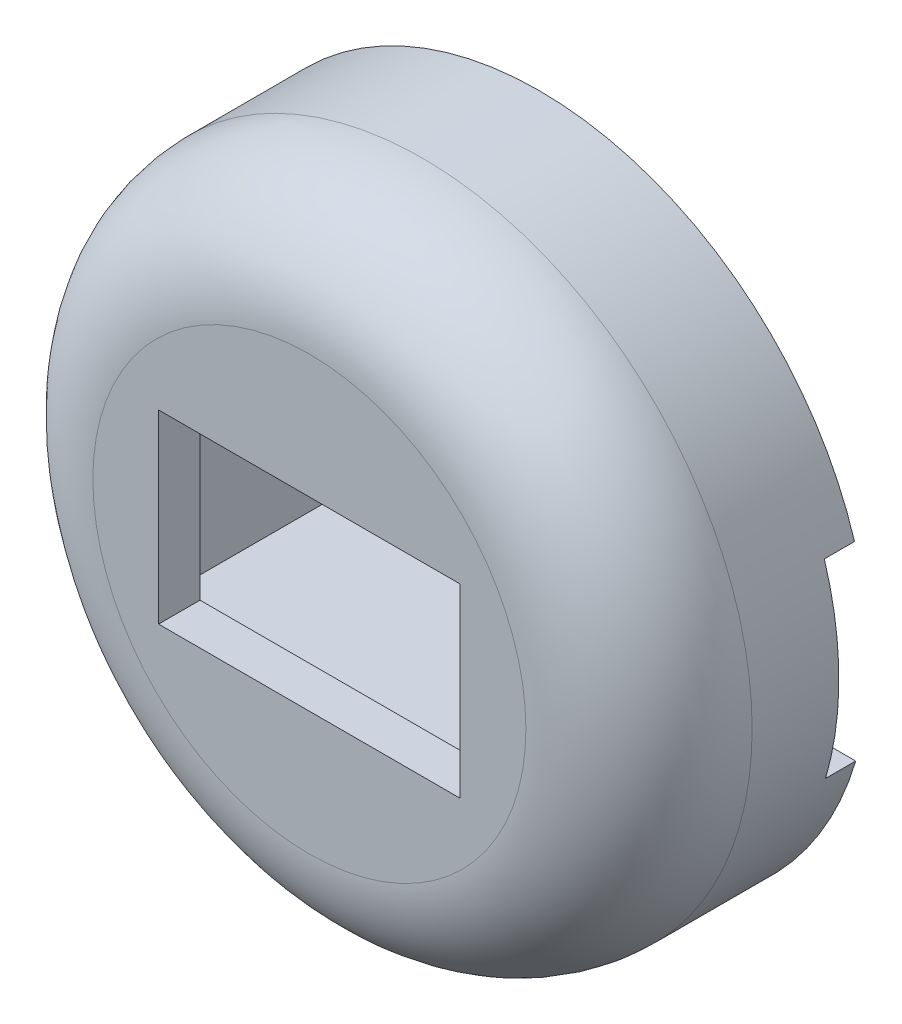
ISO-10303-21;
HEADER;
FILE_DESCRIPTION(('STEP AP214'),'2;1');
FILE_NAME('part.step','',(''),(''),'','','');
FILE_SCHEMA(('AUTOMOTIVE_DESIGN { 1 0 10303 214 1 1 1 1 }'));
ENDSEC;
DATA;
#1=APPLICATION_CONTEXT('core data for automotive mechanical design processes');
#2=APPLICATION_PROTOCOL_DEFINITION('international standard','automotive_design',2000,#1);
#3=PRODUCT_CONTEXT('',#1,'mechanical');
#4=PRODUCT('Part','Part','',(#3));
#5=PRODUCT_RELATED_PRODUCT_CATEGORY('part','',(#4));
#6=PRODUCT_DEFINITION_FORMATION('','',#4);
#7=PRODUCT_DEFINITION_CONTEXT('part definition',#1,'design');
#8=PRODUCT_DEFINITION('design','',#6,#7);
#9=PRODUCT_DEFINITION_SHAPE('','',#8);
#10=(LENGTH_UNIT() NAMED_UNIT(*) SI_UNIT(.MILLI.,.METRE.));
#11=(NAMED_UNIT(*) PLANE_ANGLE_UNIT() SI_UNIT($,.RADIAN.));
#12=(NAMED_UNIT(*) SI_UNIT($,.STERADIAN.) SOLID_ANGLE_UNIT());
#13=UNCERTAINTY_MEASURE_WITH_UNIT(LENGTH_MEASURE(1.E-05),#10,'distance_accuracy_value','');
#14=(GEOMETRIC_REPRESENTATION_CONTEXT(3) GLOBAL_UNCERTAINTY_ASSIGNED_CONTEXT((#13)) GLOBAL_UNIT_ASSIGNED_CONTEXT((#10,
#11,#12)) REPRESENTATION_CONTEXT('',''));
#15=CARTESIAN_POINT('',(0.,0.,0.));
#16=DIRECTION('',(0.,0.,1.));
#17=DIRECTION('',(1.,0.,0.));
#18=AXIS2_PLACEMENT_3D('',#15,#16,#17);
#19=CARTESIAN_POINT('',(0.,0.,0.));
#20=DIRECTION('',(0.,0.,1.));
#21=DIRECTION('',(1.,0.,0.));
#22=AXIS2_PLACEMENT_3D('',#19,#20,#21);
#23=PLANE('',#22);
#24=DIRECTION('',(-1.,0.,0.));
#25=VECTOR('',#24,1.);
#26=CARTESIAN_POINT('',(49.,-27.8,0.));
#27=LINE('',#26,#25);
#28=CARTESIAN_POINT('',(-14.0585299874686,-27.8,0.));
#29=VERTEX_POINT('',#28);
#30=CARTESIAN_POINT('',(-49.,-27.8,0.));
#31=VERTEX_POINT('',#30);
#32=EDGE_CURVE('E162',#29,#31,#27,.T.);
#33=ORIENTED_EDGE('',*,*,#32,.F.);
#34=DIRECTION('',(0.,1.,0.));
#35=VECTOR('',#34,1.);
#36=CARTESIAN_POINT('',(-14.0585299874686,-215.789162496268,0.));
#37=LINE('',#36,#35);
#38=CARTESIAN_POINT('',(-14.0585299874686,-86.2817813081115,0.));
#39=VERTEX_POINT('',#38);
#40=EDGE_CURVE('E149',#39,#29,#37,.T.);
#41=ORIENTED_EDGE('',*,*,#40,.F.);
#42=CARTESIAN_POINT('',(0.,0.,0.));
#43=DIRECTION('',(0.,0.,1.));
#44=DIRECTION('',(1.,0.,0.));
#45=AXIS2_PLACEMENT_3D('',#42,#43,#44);
#46=CIRCLE('',#45,87.4196090766216);
#47=CARTESIAN_POINT('',(83.5701890529927,25.6556339379171,0.));
#48=VERTEX_POINT('',#47);
#49=EDGE_CURVE('E160',#48,#39,#46,.T.);
#50=ORIENTED_EDGE('',*,*,#49,.F.);
#51=DIRECTION('',(1.,0.,0.));
#52=VECTOR('',#51,1.);
#53=CARTESIAN_POINT('',(211.45090988206,25.6556339379171,0.));
#54=LINE('',#53,#52);
#55=CARTESIAN_POINT('',(49.,25.6556339379171,0.));
#56=VERTEX_POINT('',#55);
#57=EDGE_CURVE('E223',#56,#48,#54,.T.);
#58=ORIENTED_EDGE('',*,*,#57,.F.);
#59=DIRECTION('',(0.,-1.,0.));
#60=VECTOR('',#59,1.);
#61=CARTESIAN_POINT('',(49.,-27.8,0.));
#62=LINE('',#61,#60);
#63=CARTESIAN_POINT('',(49.,27.8,0.));
#64=VERTEX_POINT('',#63);
#65=EDGE_CURVE('E253',#64,#56,#62,.T.);
#66=ORIENTED_EDGE('',*,*,#65,.F.);
#67=DIRECTION('',(1.,0.,0.));
#68=VECTOR('',#67,1.);
#69=CARTESIAN_POINT('',(49.,27.8,0.));
#70=LINE('',#69,#68);
#71=CARTESIAN_POINT('',(-49.,27.8,0.));
#72=VERTEX_POINT('',#71);
#73=EDGE_CURVE('E249',#72,#64,#70,.T.);
#74=ORIENTED_EDGE('',*,*,#73,.F.);
#75=DIRECTION('',(0.,1.,0.));
#76=VECTOR('',#75,1.);
#77=CARTESIAN_POINT('',(-49.,-27.8,0.));
#78=LINE('',#77,#76);
#79=EDGE_CURVE('E234',#31,#72,#78,.T.);
#80=ORIENTED_EDGE('',*,*,#79,.F.);
#81=EDGE_LOOP('',(#33,#41,#50,#58,#66,#74,#80));
#82=FACE_BOUND('',#81,.T.);
#83=ADVANCED_FACE('F34',(#82),#23,.F.);
#84=CARTESIAN_POINT('',(0.,0.,61.));
#85=DIRECTION('',(0.,0.,-1.));
#86=DIRECTION('',(-1.,0.,0.));
#87=AXIS2_PLACEMENT_3D('',#84,#85,#86);
#88=CYLINDRICAL_SURFACE('',#87,87.4196090766216);
#89=ORIENTED_EDGE('',*,*,#49,.T.);
#90=DIRECTION('',(0.,0.,-1.));
#91=VECTOR('',#90,1.);
#92=CARTESIAN_POINT('',(-14.0585299874686,-86.2817813081115,61.));
#93=LINE('',#92,#91);
#94=CARTESIAN_POINT('',(-14.0585299874686,-86.2817813081115,8.));
#95=VERTEX_POINT('',#94);
#96=EDGE_CURVE('E146',#39,#95,#93,.F.);
#97=ORIENTED_EDGE('',*,*,#96,.T.);
#98=CARTESIAN_POINT('',(0.,0.,8.));
#99=DIRECTION('',(0.,0.,-1.));
#100=DIRECTION('',(-1.,0.,0.));
#101=AXIS2_PLACEMENT_3D('',#98,#99,#100);
#102=CIRCLE('',#101,87.4196090766216);
#103=CARTESIAN_POINT('',(11.0517288416866,-86.7182065123534,8.));
#104=VERTEX_POINT('',#103);
#105=EDGE_CURVE('E218',#104,#95,#102,.T.);
#106=ORIENTED_EDGE('',*,*,#105,.F.);
#107=DIRECTION('',(0.,0.,-1.));
#108=VECTOR('',#107,1.);
#109=CARTESIAN_POINT('',(11.0517288416866,-86.7182065123534,61.));
#110=LINE('',#109,#108);
#111=CARTESIAN_POINT('',(11.0517288416866,-86.7182065123534,0.));
#112=VERTEX_POINT('',#111);
#113=EDGE_CURVE('E154',#104,#112,#110,.T.);
#114=ORIENTED_EDGE('',*,*,#113,.T.);
#115=CARTESIAN_POINT('',(83.886995721085,-24.6,0.));
#116=VERTEX_POINT('',#115);
#117=EDGE_CURVE('E171',#112,#116,#46,.T.);
#118=ORIENTED_EDGE('',*,*,#117,.T.);
#119=DIRECTION('',(0.,0.,-1.));
#120=VECTOR('',#119,1.);
#121=CARTESIAN_POINT('',(83.886995721085,-24.6,61.));
#122=LINE('',#121,#120);
#123=CARTESIAN_POINT('',(83.886995721085,-24.6,8.));
#124=VERTEX_POINT('',#123);
#125=EDGE_CURVE('E230',#116,#124,#122,.F.);
#126=ORIENTED_EDGE('',*,*,#125,.T.);
#127=CARTESIAN_POINT('',(0.,0.,8.));
#128=DIRECTION('',(0.,0.,-1.));
#129=DIRECTION('',(-1.,0.,0.));
#130=AXIS2_PLACEMENT_3D('',#127,#128,#129);
#131=CIRCLE('',#130,87.4196090766216);
#132=CARTESIAN_POINT('',(83.5701890529927,25.6556339379171,8.));
#133=VERTEX_POINT('',#132);
#134=EDGE_CURVE('E226',#133,#124,#131,.T.);
#135=ORIENTED_EDGE('',*,*,#134,.F.);
#136=DIRECTION('',(0.,0.,-1.));
#137=VECTOR('',#136,1.);
#138=CARTESIAN_POINT('',(83.5701890529926,25.6556339379171,61.));
#139=LINE('',#138,#137);
#140=EDGE_CURVE('E169',#133,#48,#139,.T.);
#141=ORIENTED_EDGE('',*,*,#140,.T.);
#142=EDGE_LOOP('',(#89,#97,#106,#114,#118,#126,#135,#141));
#143=FACE_BOUND('',#142,.T.);
#144=CARTESIAN_POINT('',(0.,0.,31.));
#145=DIRECTION('',(0.,0.,1.));
#146=DIRECTION('',(1.,0.,0.));
#147=AXIS2_PLACEMENT_3D('',#144,#145,#146);
#148=CIRCLE('',#147,87.4196090766216);
#149=CARTESIAN_POINT('',(87.4196090766216,0.,31.));
#150=VERTEX_POINT('',#149);
#151=EDGE_CURVE('E174',#150,#150,#148,.F.);
#152=ORIENTED_EDGE('',*,*,#151,.T.);
#153=EDGE_LOOP('',(#152));
#154=FACE_BOUND('',#153,.T.);
#155=ADVANCED_FACE('F166',(#143,#154),#88,.T.);
#156=CARTESIAN_POINT('',(0.,0.,61.));
#157=DIRECTION('',(0.,0.,1.));
#158=DIRECTION('',(1.,0.,0.));
#159=AXIS2_PLACEMENT_3D('',#156,#157,#158);
#160=PLANE('',#159);
#161=DIRECTION('',(1.,0.,0.));
#162=VECTOR('',#161,1.);
#163=CARTESIAN_POINT('',(-40.,-24.6,61.));
#164=LINE('',#163,#162);
#165=CARTESIAN_POINT('',(-40.,-24.6,61.));
#166=VERTEX_POINT('',#165);
#167=CARTESIAN_POINT('',(40.,-24.6,61.));
#168=VERTEX_POINT('',#167);
#169=EDGE_CURVE('E274',#166,#168,#164,.T.);
#170=ORIENTED_EDGE('',*,*,#169,.F.);
#171=DIRECTION('',(0.,-1.,0.));
#172=VECTOR('',#171,1.);
#173=CARTESIAN_POINT('',(-40.,24.6,61.));
#174=LINE('',#173,#172);
#175=CARTESIAN_POINT('',(-40.,24.6,61.));
#176=VERTEX_POINT('',#175);
#177=EDGE_CURVE('E283',#176,#166,#174,.T.);
#178=ORIENTED_EDGE('',*,*,#177,.F.);
#179=DIRECTION('',(1.,0.,0.));
#180=VECTOR('',#179,1.);
#181=CARTESIAN_POINT('',(-40.,24.6,61.));
#182=LINE('',#181,#180);
#183=CARTESIAN_POINT('',(40.,24.6,61.));
#184=VERTEX_POINT('',#183);
#185=EDGE_CURVE('E280',#176,#184,#182,.T.);
#186=ORIENTED_EDGE('',*,*,#185,.T.);
#187=DIRECTION('',(0.,-1.,0.));
#188=VECTOR('',#187,1.);
#189=CARTESIAN_POINT('',(40.,24.6,61.));
#190=LINE('',#189,#188);
#191=EDGE_CURVE('E277',#184,#168,#190,.T.);
#192=ORIENTED_EDGE('',*,*,#191,.T.);
#193=EDGE_LOOP('',(#170,#178,#186,#192));
#194=FACE_BOUND('',#193,.T.);
#195=CARTESIAN_POINT('',(0.,0.,61.));
#196=DIRECTION('',(0.,0.,1.));
#197=DIRECTION('',(1.,0.,0.));
#198=AXIS2_PLACEMENT_3D('',#195,#196,#197);
#199=CIRCLE('',#198,57.4196090766216);
#200=CARTESIAN_POINT('',(57.4196090766216,0.,61.));
#201=VERTEX_POINT('',#200);
#202=EDGE_CURVE('E170',#201,#201,#199,.T.);
#203=ORIENTED_EDGE('',*,*,#202,.T.);
#204=EDGE_LOOP('',(#203));
#205=FACE_BOUND('',#204,.T.);
#206=ADVANCED_FACE('F304',(#194,#205),#160,.T.);
#207=ORIENTED_EDGE('',*,*,#117,.F.);
#208=DIRECTION('',(0.,-1.,0.));
#209=VECTOR('',#208,1.);
#210=CARTESIAN_POINT('',(11.0517288416866,-215.789162496268,0.));
#211=LINE('',#210,#209);
#212=CARTESIAN_POINT('',(11.0517288416866,-27.8,0.));
#213=VERTEX_POINT('',#212);
#214=EDGE_CURVE('E163',#213,#112,#211,.T.);
#215=ORIENTED_EDGE('',*,*,#214,.F.);
#216=CARTESIAN_POINT('',(49.,-27.8,0.));
#217=VERTEX_POINT('',#216);
#218=EDGE_CURVE('E201',#217,#213,#27,.T.);
#219=ORIENTED_EDGE('',*,*,#218,.F.);
#220=CARTESIAN_POINT('',(49.,-24.6,0.));
#221=VERTEX_POINT('',#220);
#222=EDGE_CURVE('E252',#221,#217,#62,.T.);
#223=ORIENTED_EDGE('',*,*,#222,.F.);
#224=DIRECTION('',(-1.,0.,0.));
#225=VECTOR('',#224,1.);
#226=CARTESIAN_POINT('',(211.45090988206,-24.6,0.));
#227=LINE('',#226,#225);
#228=EDGE_CURVE('E153',#116,#221,#227,.T.);
#229=ORIENTED_EDGE('',*,*,#228,.F.);
#230=EDGE_LOOP('',(#207,#215,#219,#223,#229));
#231=FACE_BOUND('',#230,.T.);
#232=ADVANCED_FACE('F211',(#231),#23,.F.);
#233=CARTESIAN_POINT('',(0.,0.,31.));
#234=DIRECTION('',(0.,0.,1.));
#235=DIRECTION('',(1.,0.,0.));
#236=AXIS2_PLACEMENT_3D('',#233,#234,#235);
#237=TOROIDAL_SURFACE('',#236,57.4196090766216,30.);
#238=ORIENTED_EDGE('',*,*,#151,.F.);
#239=EDGE_LOOP('',(#238));
#240=FACE_BOUND('',#239,.T.);
#241=ORIENTED_EDGE('',*,*,#202,.F.);
#242=EDGE_LOOP('',(#241));
#243=FACE_BOUND('',#242,.T.);
#244=ADVANCED_FACE('F36',(#240,#243),#237,.T.);
#245=CARTESIAN_POINT('',(-40.,-24.6,0.));
#246=DIRECTION('',(0.,-1.,0.));
#247=DIRECTION('',(0.,0.,-1.));
#248=AXIS2_PLACEMENT_3D('',#245,#246,#247);
#249=PLANE('',#248);
#250=DIRECTION('',(0.,0.,1.));
#251=VECTOR('',#250,1.);
#252=CARTESIAN_POINT('',(40.,-24.6,0.));
#253=LINE('',#252,#251);
#254=CARTESIAN_POINT('',(40.,-24.6,50.));
#255=VERTEX_POINT('',#254);
#256=EDGE_CURVE('E178',#255,#168,#253,.T.);
#257=ORIENTED_EDGE('',*,*,#256,.F.);
#258=DIRECTION('',(-1.,0.,0.));
#259=VECTOR('',#258,1.);
#260=CARTESIAN_POINT('',(-40.,-24.6,50.));
#261=LINE('',#260,#259);
#262=CARTESIAN_POINT('',(-40.,-24.6,50.));
#263=VERTEX_POINT('',#262);
#264=EDGE_CURVE('E271',#255,#263,#261,.T.);
#265=ORIENTED_EDGE('',*,*,#264,.T.);
#266=DIRECTION('',(0.,0.,1.));
#267=VECTOR('',#266,1.);
#268=CARTESIAN_POINT('',(-40.,-24.6,0.));
#269=LINE('',#268,#267);
#270=EDGE_CURVE('E176',#263,#166,#269,.T.);
#271=ORIENTED_EDGE('',*,*,#270,.T.);
#272=ORIENTED_EDGE('',*,*,#169,.T.);
#273=EDGE_LOOP('',(#257,#265,#271,#272));
#274=FACE_BOUND('',#273,.T.);
#275=ADVANCED_FACE('F300',(#274),#249,.F.);
#276=CARTESIAN_POINT('',(-40.,24.6,0.));
#277=DIRECTION('',(-1.,0.,0.));
#278=DIRECTION('',(0.,-1.,0.));
#279=AXIS2_PLACEMENT_3D('',#276,#277,#278);
#280=PLANE('',#279);
#281=ORIENTED_EDGE('',*,*,#270,.F.);
#282=DIRECTION('',(0.,1.,0.));
#283=VECTOR('',#282,1.);
#284=CARTESIAN_POINT('',(-40.,24.6,50.));
#285=LINE('',#284,#283);
#286=CARTESIAN_POINT('',(-40.,24.6,50.));
#287=VERTEX_POINT('',#286);
#288=EDGE_CURVE('E268',#263,#287,#285,.T.);
#289=ORIENTED_EDGE('',*,*,#288,.T.);
#290=DIRECTION('',(0.,0.,1.));
#291=VECTOR('',#290,1.);
#292=CARTESIAN_POINT('',(-40.,24.6,0.));
#293=LINE('',#292,#291);
#294=EDGE_CURVE('E287',#287,#176,#293,.T.);
#295=ORIENTED_EDGE('',*,*,#294,.T.);
#296=ORIENTED_EDGE('',*,*,#177,.T.);
#297=EDGE_LOOP('',(#281,#289,#295,#296));
#298=FACE_BOUND('',#297,.T.);
#299=ADVANCED_FACE('F309',(#298),#280,.F.);
#300=CARTESIAN_POINT('',(-40.,24.6,0.));
#301=DIRECTION('',(0.,-1.,0.));
#302=DIRECTION('',(1.,0.,0.));
#303=AXIS2_PLACEMENT_3D('',#300,#301,#302);
#304=PLANE('',#303);
#305=DIRECTION('',(-1.,0.,0.));
#306=VECTOR('',#305,1.);
#307=CARTESIAN_POINT('',(-40.,24.6,50.));
#308=LINE('',#307,#306);
#309=CARTESIAN_POINT('',(40.,24.6,50.));
#310=VERTEX_POINT('',#309);
#311=EDGE_CURVE('E260',#310,#287,#308,.T.);
#312=ORIENTED_EDGE('',*,*,#311,.F.);
#313=DIRECTION('',(0.,0.,1.));
#314=VECTOR('',#313,1.);
#315=CARTESIAN_POINT('',(40.,24.6,0.));
#316=LINE('',#315,#314);
#317=EDGE_CURVE('E288',#310,#184,#316,.T.);
#318=ORIENTED_EDGE('',*,*,#317,.T.);
#319=ORIENTED_EDGE('',*,*,#185,.F.);
#320=ORIENTED_EDGE('',*,*,#294,.F.);
#321=EDGE_LOOP('',(#312,#318,#319,#320));
#322=FACE_BOUND('',#321,.T.);
#323=ADVANCED_FACE('F307',(#322),#304,.T.);
#324=CARTESIAN_POINT('',(40.,24.6,0.));
#325=DIRECTION('',(-1.,0.,0.));
#326=DIRECTION('',(0.,-1.,0.));
#327=AXIS2_PLACEMENT_3D('',#324,#325,#326);
#328=PLANE('',#327);
#329=DIRECTION('',(0.,1.,0.));
#330=VECTOR('',#329,1.);
#331=CARTESIAN_POINT('',(40.,24.6,50.));
#332=LINE('',#331,#330);
#333=EDGE_CURVE('E183',#255,#310,#332,.T.);
#334=ORIENTED_EDGE('',*,*,#333,.F.);
#335=ORIENTED_EDGE('',*,*,#256,.T.);
#336=ORIENTED_EDGE('',*,*,#191,.F.);
#337=ORIENTED_EDGE('',*,*,#317,.F.);
#338=EDGE_LOOP('',(#334,#335,#336,#337));
#339=FACE_BOUND('',#338,.T.);
#340=ADVANCED_FACE('F297',(#339),#328,.T.);
#341=CARTESIAN_POINT('',(0.,0.,50.));
#342=DIRECTION('',(0.,0.,1.));
#343=DIRECTION('',(1.,0.,0.));
#344=AXIS2_PLACEMENT_3D('',#341,#342,#343);
#345=PLANE('',#344);
#346=DIRECTION('',(0.,1.,0.));
#347=VECTOR('',#346,1.);
#348=CARTESIAN_POINT('',(-49.,-27.8,50.));
#349=LINE('',#348,#347);
#350=CARTESIAN_POINT('',(-49.,-27.8,50.));
#351=VERTEX_POINT('',#350);
#352=CARTESIAN_POINT('',(-49.,27.8,50.));
#353=VERTEX_POINT('',#352);
#354=EDGE_CURVE('E235',#351,#353,#349,.T.);
#355=ORIENTED_EDGE('',*,*,#354,.T.);
#356=DIRECTION('',(1.,0.,0.));
#357=VECTOR('',#356,1.);
#358=CARTESIAN_POINT('',(49.,27.8,50.));
#359=LINE('',#358,#357);
#360=CARTESIAN_POINT('',(49.,27.8,50.));
#361=VERTEX_POINT('',#360);
#362=EDGE_CURVE('E238',#353,#361,#359,.T.);
#363=ORIENTED_EDGE('',*,*,#362,.T.);
#364=DIRECTION('',(0.,-1.,0.));
#365=VECTOR('',#364,1.);
#366=CARTESIAN_POINT('',(49.,-27.8,50.));
#367=LINE('',#366,#365);
#368=CARTESIAN_POINT('',(49.,-27.8,50.));
#369=VERTEX_POINT('',#368);
#370=EDGE_CURVE('E241',#361,#369,#367,.T.);
#371=ORIENTED_EDGE('',*,*,#370,.T.);
#372=DIRECTION('',(-1.,0.,0.));
#373=VECTOR('',#372,1.);
#374=CARTESIAN_POINT('',(49.,-27.8,50.));
#375=LINE('',#374,#373);
#376=EDGE_CURVE('E244',#369,#351,#375,.T.);
#377=ORIENTED_EDGE('',*,*,#376,.T.);
#378=EDGE_LOOP('',(#355,#363,#371,#377));
#379=FACE_BOUND('',#378,.T.);
#380=ORIENTED_EDGE('',*,*,#333,.T.);
#381=ORIENTED_EDGE('',*,*,#311,.T.);
#382=ORIENTED_EDGE('',*,*,#288,.F.);
#383=ORIENTED_EDGE('',*,*,#264,.F.);
#384=EDGE_LOOP('',(#380,#381,#382,#383));
#385=FACE_BOUND('',#384,.T.);
#386=ADVANCED_FACE('F311',(#379,#385),#345,.F.);
#387=CARTESIAN_POINT('',(-49.,-27.8,50.));
#388=DIRECTION('',(-1.,0.,0.));
#389=DIRECTION('',(0.,0.,1.));
#390=AXIS2_PLACEMENT_3D('',#387,#388,#389);
#391=PLANE('',#390);
#392=ORIENTED_EDGE('',*,*,#79,.T.);
#393=DIRECTION('',(0.,0.,-1.));
#394=VECTOR('',#393,1.);
#395=CARTESIAN_POINT('',(-49.,27.8,50.));
#396=LINE('',#395,#394);
#397=EDGE_CURVE('E247',#353,#72,#396,.T.);
#398=ORIENTED_EDGE('',*,*,#397,.F.);
#399=ORIENTED_EDGE('',*,*,#354,.F.);
#400=DIRECTION('',(0.,0.,-1.));
#401=VECTOR('',#400,1.);
#402=CARTESIAN_POINT('',(-49.,-27.8,50.));
#403=LINE('',#402,#401);
#404=EDGE_CURVE('E257',#351,#31,#403,.T.);
#405=ORIENTED_EDGE('',*,*,#404,.T.);
#406=EDGE_LOOP('',(#392,#398,#399,#405));
#407=FACE_BOUND('',#406,.T.);
#408=ADVANCED_FACE('F313',(#407),#391,.F.);
#409=CARTESIAN_POINT('',(49.,-27.8,50.));
#410=DIRECTION('',(0.,-1.,0.));
#411=DIRECTION('',(0.,0.,-1.));
#412=AXIS2_PLACEMENT_3D('',#409,#410,#411);
#413=PLANE('',#412);
#414=DIRECTION('',(1.,0.,0.));
#415=VECTOR('',#414,1.);
#416=CARTESIAN_POINT('',(49.,-27.8,8.));
#417=LINE('',#416,#415);
#418=CARTESIAN_POINT('',(-14.0585299874686,-27.8,8.));
#419=VERTEX_POINT('',#418);
#420=CARTESIAN_POINT('',(11.0517288416866,-27.8,8.));
#421=VERTEX_POINT('',#420);
#422=EDGE_CURVE('E193',#419,#421,#417,.T.);
#423=ORIENTED_EDGE('',*,*,#422,.F.);
#424=DIRECTION('',(0.,0.,-1.));
#425=VECTOR('',#424,1.);
#426=CARTESIAN_POINT('',(-14.0585299874686,-27.8,50.));
#427=LINE('',#426,#425);
#428=EDGE_CURVE('E11',#419,#29,#427,.T.);
#429=ORIENTED_EDGE('',*,*,#428,.T.);
#430=ORIENTED_EDGE('',*,*,#32,.T.);
#431=ORIENTED_EDGE('',*,*,#404,.F.);
#432=ORIENTED_EDGE('',*,*,#376,.F.);
#433=DIRECTION('',(0.,0.,-1.));
#434=VECTOR('',#433,1.);
#435=CARTESIAN_POINT('',(49.,-27.8,50.));
#436=LINE('',#435,#434);
#437=EDGE_CURVE('E261',#369,#217,#436,.T.);
#438=ORIENTED_EDGE('',*,*,#437,.T.);
#439=ORIENTED_EDGE('',*,*,#218,.T.);
#440=DIRECTION('',(0.,0.,1.));
#441=VECTOR('',#440,1.);
#442=CARTESIAN_POINT('',(11.0517288416866,-27.8,50.));
#443=LINE('',#442,#441);
#444=EDGE_CURVE('E42',#213,#421,#443,.T.);
#445=ORIENTED_EDGE('',*,*,#444,.T.);
#446=EDGE_LOOP('',(#423,#429,#430,#431,#432,#438,#439,#445));
#447=FACE_BOUND('',#446,.T.);
#448=ADVANCED_FACE('F198',(#447),#413,.F.);
#449=CARTESIAN_POINT('',(49.,-27.8,50.));
#450=DIRECTION('',(1.,0.,0.));
#451=DIRECTION('',(0.,0.,-1.));
#452=AXIS2_PLACEMENT_3D('',#449,#450,#451);
#453=PLANE('',#452);
#454=ORIENTED_EDGE('',*,*,#65,.T.);
#455=DIRECTION('',(0.,0.,1.));
#456=VECTOR('',#455,1.);
#457=CARTESIAN_POINT('',(49.,25.6556339379171,50.));
#458=LINE('',#457,#456);
#459=CARTESIAN_POINT('',(49.,25.6556339379171,8.));
#460=VERTEX_POINT('',#459);
#461=EDGE_CURVE('E190',#56,#460,#458,.T.);
#462=ORIENTED_EDGE('',*,*,#461,.T.);
#463=DIRECTION('',(0.,1.,0.));
#464=VECTOR('',#463,1.);
#465=CARTESIAN_POINT('',(49.,-27.8,8.));
#466=LINE('',#465,#464);
#467=CARTESIAN_POINT('',(49.,-24.6,8.));
#468=VERTEX_POINT('',#467);
#469=EDGE_CURVE('E185',#468,#460,#466,.T.);
#470=ORIENTED_EDGE('',*,*,#469,.F.);
#471=DIRECTION('',(0.,0.,-1.));
#472=VECTOR('',#471,1.);
#473=CARTESIAN_POINT('',(49.,-24.6,50.));
#474=LINE('',#473,#472);
#475=EDGE_CURVE('E187',#468,#221,#474,.T.);
#476=ORIENTED_EDGE('',*,*,#475,.T.);
#477=ORIENTED_EDGE('',*,*,#222,.T.);
#478=ORIENTED_EDGE('',*,*,#437,.F.);
#479=ORIENTED_EDGE('',*,*,#370,.F.);
#480=DIRECTION('',(0.,0.,-1.));
#481=VECTOR('',#480,1.);
#482=CARTESIAN_POINT('',(49.,27.8,50.));
#483=LINE('',#482,#481);
#484=EDGE_CURVE('E263',#361,#64,#483,.T.);
#485=ORIENTED_EDGE('',*,*,#484,.T.);
#486=EDGE_LOOP('',(#454,#462,#470,#476,#477,#478,#479,#485));
#487=FACE_BOUND('',#486,.T.);
#488=ADVANCED_FACE('F354',(#487),#453,.F.);
#489=CARTESIAN_POINT('',(49.,27.8,50.));
#490=DIRECTION('',(0.,1.,0.));
#491=DIRECTION('',(0.,0.,1.));
#492=AXIS2_PLACEMENT_3D('',#489,#490,#491);
#493=PLANE('',#492);
#494=ORIENTED_EDGE('',*,*,#73,.T.);
#495=ORIENTED_EDGE('',*,*,#484,.F.);
#496=ORIENTED_EDGE('',*,*,#362,.F.);
#497=ORIENTED_EDGE('',*,*,#397,.T.);
#498=EDGE_LOOP('',(#494,#495,#496,#497));
#499=FACE_BOUND('',#498,.T.);
#500=ADVANCED_FACE('F350',(#499),#493,.F.);
#501=CARTESIAN_POINT('',(211.45090988206,25.6556339379171,8.));
#502=DIRECTION('',(0.,1.,0.));
#503=DIRECTION('',(0.,0.,1.));
#504=AXIS2_PLACEMENT_3D('',#501,#502,#503);
#505=PLANE('',#504);
#506=DIRECTION('',(1.,0.,0.));
#507=VECTOR('',#506,1.);
#508=CARTESIAN_POINT('',(211.45090988206,25.6556339379171,8.));
#509=LINE('',#508,#507);
#510=EDGE_CURVE('E222',#460,#133,#509,.T.);
#511=ORIENTED_EDGE('',*,*,#510,.F.);
#512=ORIENTED_EDGE('',*,*,#461,.F.);
#513=ORIENTED_EDGE('',*,*,#57,.T.);
#514=ORIENTED_EDGE('',*,*,#140,.F.);
#515=EDGE_LOOP('',(#511,#512,#513,#514));
#516=FACE_BOUND('',#515,.T.);
#517=ADVANCED_FACE('F353',(#516),#505,.F.);
#518=CARTESIAN_POINT('',(211.45090988206,-24.6,8.));
#519=DIRECTION('',(0.,-1.,0.));
#520=DIRECTION('',(0.,0.,-1.));
#521=AXIS2_PLACEMENT_3D('',#518,#519,#520);
#522=PLANE('',#521);
#523=ORIENTED_EDGE('',*,*,#228,.T.);
#524=ORIENTED_EDGE('',*,*,#475,.F.);
#525=DIRECTION('',(-1.,0.,0.));
#526=VECTOR('',#525,1.);
#527=CARTESIAN_POINT('',(211.45090988206,-24.6,8.));
#528=LINE('',#527,#526);
#529=EDGE_CURVE('E57',#124,#468,#528,.T.);
#530=ORIENTED_EDGE('',*,*,#529,.F.);
#531=ORIENTED_EDGE('',*,*,#125,.F.);
#532=EDGE_LOOP('',(#523,#524,#530,#531));
#533=FACE_BOUND('',#532,.T.);
#534=ADVANCED_FACE('F383',(#533),#522,.F.);
#535=CARTESIAN_POINT('',(0.,0.,8.));
#536=DIRECTION('',(0.,0.,-1.));
#537=DIRECTION('',(-1.,0.,0.));
#538=AXIS2_PLACEMENT_3D('',#535,#536,#537);
#539=PLANE('',#538);
#540=ORIENTED_EDGE('',*,*,#134,.T.);
#541=ORIENTED_EDGE('',*,*,#529,.T.);
#542=ORIENTED_EDGE('',*,*,#469,.T.);
#543=ORIENTED_EDGE('',*,*,#510,.T.);
#544=EDGE_LOOP('',(#540,#541,#542,#543));
#545=FACE_BOUND('',#544,.T.);
#546=ADVANCED_FACE('F392',(#545),#539,.T.);
#547=CARTESIAN_POINT('',(-14.0585299874686,-215.789162496268,8.));
#548=DIRECTION('',(-1.,0.,0.));
#549=DIRECTION('',(0.,0.,1.));
#550=AXIS2_PLACEMENT_3D('',#547,#548,#549);
#551=PLANE('',#550);
#552=ORIENTED_EDGE('',*,*,#40,.T.);
#553=ORIENTED_EDGE('',*,*,#428,.F.);
#554=DIRECTION('',(0.,1.,0.));
#555=VECTOR('',#554,1.);
#556=CARTESIAN_POINT('',(-14.0585299874686,-215.789162496268,8.));
#557=LINE('',#556,#555);
#558=EDGE_CURVE('E49',#95,#419,#557,.T.);
#559=ORIENTED_EDGE('',*,*,#558,.F.);
#560=ORIENTED_EDGE('',*,*,#96,.F.);
#561=EDGE_LOOP('',(#552,#553,#559,#560));
#562=FACE_BOUND('',#561,.T.);
#563=ADVANCED_FACE('F148',(#562),#551,.F.);
#564=CARTESIAN_POINT('',(11.0517288416866,-215.789162496268,8.));
#565=DIRECTION('',(1.,0.,0.));
#566=DIRECTION('',(0.,0.,-1.));
#567=AXIS2_PLACEMENT_3D('',#564,#565,#566);
#568=PLANE('',#567);
#569=DIRECTION('',(0.,-1.,0.));
#570=VECTOR('',#569,1.);
#571=CARTESIAN_POINT('',(11.0517288416866,-215.789162496268,8.));
#572=LINE('',#571,#570);
#573=EDGE_CURVE('E208',#421,#104,#572,.T.);
#574=ORIENTED_EDGE('',*,*,#573,.F.);
#575=ORIENTED_EDGE('',*,*,#444,.F.);
#576=ORIENTED_EDGE('',*,*,#214,.T.);
#577=ORIENTED_EDGE('',*,*,#113,.F.);
#578=EDGE_LOOP('',(#574,#575,#576,#577));
#579=FACE_BOUND('',#578,.T.);
#580=ADVANCED_FACE('F205',(#579),#568,.F.);
#581=CARTESIAN_POINT('',(0.,0.,8.));
#582=DIRECTION('',(0.,0.,-1.));
#583=DIRECTION('',(-1.,0.,0.));
#584=AXIS2_PLACEMENT_3D('',#581,#582,#583);
#585=PLANE('',#584);
#586=ORIENTED_EDGE('',*,*,#105,.T.);
#587=ORIENTED_EDGE('',*,*,#558,.T.);
#588=ORIENTED_EDGE('',*,*,#422,.T.);
#589=ORIENTED_EDGE('',*,*,#573,.T.);
#590=EDGE_LOOP('',(#586,#587,#588,#589));
#591=FACE_BOUND('',#590,.T.);
#592=ADVANCED_FACE('F414',(#591),#585,.T.);
#593=CLOSED_SHELL('',(#83,#155,#206,#232,#244,#275,#299,#323,#340,#386,#408,#448,#488,#500,#517,
#534,#546,#563,#580,#592));
#594=MANIFOLD_SOLID_BREP('B2',#593);
#595=ADVANCED_BREP_SHAPE_REPRESENTATION('',(#18,#594),#14);
#596=SHAPE_DEFINITION_REPRESENTATION(#9,#595);
ENDSEC;
END-ISO-10303-21;
